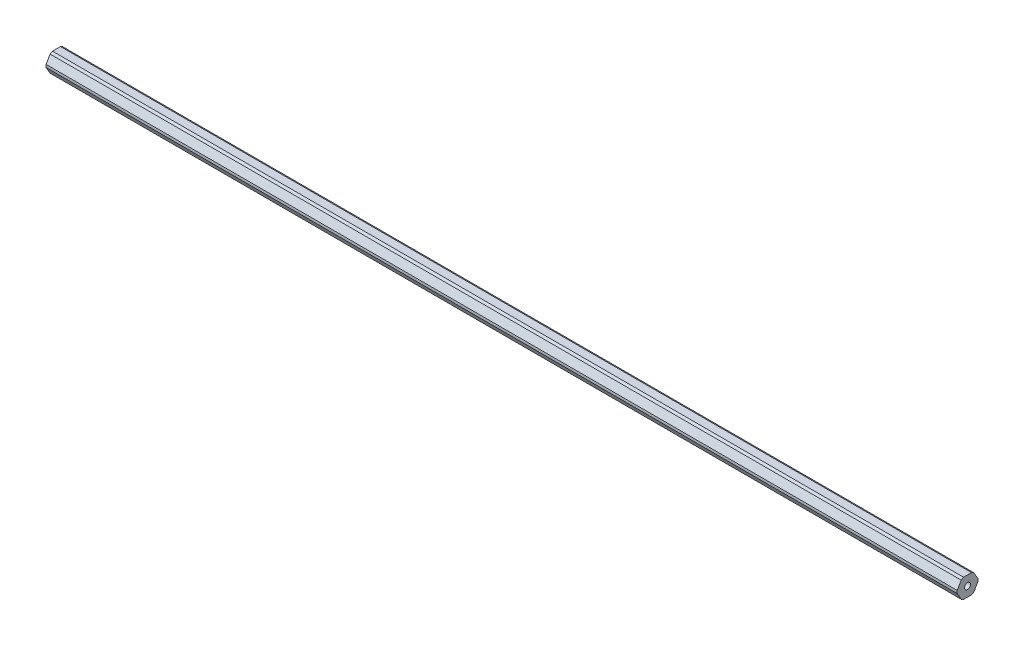
ISO-10303-21;
HEADER;
FILE_DESCRIPTION(('STEP AP214'),'2;1');
FILE_NAME('part.step','',(''),(''),'','','');
FILE_SCHEMA(('AUTOMOTIVE_DESIGN { 1 0 10303 214 1 1 1 1 }'));
ENDSEC;
DATA;
#1=APPLICATION_CONTEXT('core data for automotive mechanical design processes');
#2=APPLICATION_PROTOCOL_DEFINITION('international standard','automotive_design',2000,#1);
#3=PRODUCT_CONTEXT('',#1,'mechanical');
#4=PRODUCT('Part','Part','',(#3));
#5=PRODUCT_RELATED_PRODUCT_CATEGORY('part','',(#4));
#6=PRODUCT_DEFINITION_FORMATION('','',#4);
#7=PRODUCT_DEFINITION_CONTEXT('part definition',#1,'design');
#8=PRODUCT_DEFINITION('design','',#6,#7);
#9=PRODUCT_DEFINITION_SHAPE('','',#8);
#10=(LENGTH_UNIT() NAMED_UNIT(*) SI_UNIT(.MILLI.,.METRE.));
#11=(NAMED_UNIT(*) PLANE_ANGLE_UNIT() SI_UNIT($,.RADIAN.));
#12=(NAMED_UNIT(*) SI_UNIT($,.STERADIAN.) SOLID_ANGLE_UNIT());
#13=UNCERTAINTY_MEASURE_WITH_UNIT(LENGTH_MEASURE(1.E-05),#10,'distance_accuracy_value','');
#14=(GEOMETRIC_REPRESENTATION_CONTEXT(3) GLOBAL_UNCERTAINTY_ASSIGNED_CONTEXT((#13)) GLOBAL_UNIT_ASSIGNED_CONTEXT((#10,
#11,#12)) REPRESENTATION_CONTEXT('',''));
#15=CARTESIAN_POINT('',(0.,0.,0.));
#16=DIRECTION('',(0.,0.,1.));
#17=DIRECTION('',(1.,0.,0.));
#18=AXIS2_PLACEMENT_3D('',#15,#16,#17);
#19=CARTESIAN_POINT('',(293.6875,-47.9404901301149,172.641597773738));
#20=DIRECTION('',(0.,-0.5,0.866025403784439));
#21=DIRECTION('',(0.,-0.866025403784439,-0.5));
#22=AXIS2_PLACEMENT_3D('',#19,#20,#21);
#23=PLANE('',#22);
#24=DIRECTION('',(-1.,0.,0.));
#25=VECTOR('',#24,1.);
#26=CARTESIAN_POINT('',(293.6875,-50.221308772571,171.324766516543));
#27=LINE('',#26,#25);
#28=CARTESIAN_POINT('',(293.6875,-50.221308772571,171.324766516543));
#29=VERTEX_POINT('',#28);
#30=CARTESIAN_POINT('',(-306.3875,-50.2213087725709,171.324766516543));
#31=VERTEX_POINT('',#30);
#32=EDGE_CURVE('E183',#29,#31,#27,.T.);
#33=ORIENTED_EDGE('',*,*,#32,.T.);
#34=DIRECTION('',(0.,-0.866025403784438,-0.5));
#35=VECTOR('',#34,1.);
#36=CARTESIAN_POINT('',(-306.3875,-47.9404901301149,172.641597773738));
#37=LINE('',#36,#35);
#38=CARTESIAN_POINT('',(-306.3875,-45.6596714876589,173.958429030933));
#39=VERTEX_POINT('',#38);
#40=EDGE_CURVE('E143',#39,#31,#37,.T.);
#41=ORIENTED_EDGE('',*,*,#40,.F.);
#42=DIRECTION('',(-1.,0.,0.));
#43=VECTOR('',#42,1.);
#44=CARTESIAN_POINT('',(293.6875,-45.6596714876588,173.958429030933));
#45=LINE('',#44,#43);
#46=CARTESIAN_POINT('',(293.6875,-45.6596714876588,173.958429030933));
#47=VERTEX_POINT('',#46);
#48=EDGE_CURVE('E186',#39,#47,#45,.F.);
#49=ORIENTED_EDGE('',*,*,#48,.T.);
#50=DIRECTION('',(0.,0.866025403784439,0.5));
#51=VECTOR('',#50,1.);
#52=CARTESIAN_POINT('',(293.6875,-47.9404901301149,172.641597773738));
#53=LINE('',#52,#51);
#54=EDGE_CURVE('E194',#29,#47,#53,.T.);
#55=ORIENTED_EDGE('',*,*,#54,.F.);
#56=EDGE_LOOP('',(#33,#41,#49,#55));
#57=FACE_BOUND('',#56,.T.);
#58=ADVANCED_FACE('F17',(#57),#23,.F.);
#59=CARTESIAN_POINT('',(293.6875,-44.7652166473933,178.141332773738));
#60=DIRECTION('',(0.,-1.,0.));
#61=DIRECTION('',(0.,0.,-1.));
#62=AXIS2_PLACEMENT_3D('',#59,#60,#61);
#63=PLANE('',#62);
#64=DIRECTION('',(-1.,0.,0.));
#65=VECTOR('',#64,1.);
#66=CARTESIAN_POINT('',(293.6875,-44.7652166473933,175.507670259349));
#67=LINE('',#66,#65);
#68=CARTESIAN_POINT('',(293.6875,-44.7652166473933,175.507670259349));
#69=VERTEX_POINT('',#68);
#70=CARTESIAN_POINT('',(-306.3875,-44.7652166473933,175.507670259349));
#71=VERTEX_POINT('',#70);
#72=EDGE_CURVE('E118',#69,#71,#67,.T.);
#73=ORIENTED_EDGE('',*,*,#72,.T.);
#74=DIRECTION('',(0.,0.,-1.));
#75=VECTOR('',#74,1.);
#76=CARTESIAN_POINT('',(-306.3875,-44.7652166473933,178.141332773738));
#77=LINE('',#76,#75);
#78=CARTESIAN_POINT('',(-306.3875,-44.7652166473933,180.774995288128));
#79=VERTEX_POINT('',#78);
#80=EDGE_CURVE('E136',#79,#71,#77,.T.);
#81=ORIENTED_EDGE('',*,*,#80,.F.);
#82=DIRECTION('',(-1.,0.,0.));
#83=VECTOR('',#82,1.);
#84=CARTESIAN_POINT('',(293.6875,-44.7652166473933,180.774995288128));
#85=LINE('',#84,#83);
#86=CARTESIAN_POINT('',(293.6875,-44.7652166473933,180.774995288128));
#87=VERTEX_POINT('',#86);
#88=EDGE_CURVE('E179',#79,#87,#85,.F.);
#89=ORIENTED_EDGE('',*,*,#88,.T.);
#90=DIRECTION('',(0.,0.,1.));
#91=VECTOR('',#90,1.);
#92=CARTESIAN_POINT('',(293.6875,-44.7652166473933,178.141332773738));
#93=LINE('',#92,#91);
#94=EDGE_CURVE('E198',#69,#87,#93,.T.);
#95=ORIENTED_EDGE('',*,*,#94,.F.);
#96=EDGE_LOOP('',(#73,#81,#89,#95));
#97=FACE_BOUND('',#96,.T.);
#98=ADVANCED_FACE('F257',(#97),#63,.F.);
#99=CARTESIAN_POINT('',(293.6875,-47.9404901301149,183.641067773738));
#100=DIRECTION('',(0.,-0.5,-0.866025403784438));
#101=DIRECTION('',(0.,0.866025403784439,-0.5));
#102=AXIS2_PLACEMENT_3D('',#99,#100,#101);
#103=PLANE('',#102);
#104=DIRECTION('',(-1.,0.,0.));
#105=VECTOR('',#104,1.);
#106=CARTESIAN_POINT('',(293.6875,-45.6596714876588,182.324236516543));
#107=LINE('',#106,#105);
#108=CARTESIAN_POINT('',(293.6875,-45.6596714876588,182.324236516543));
#109=VERTEX_POINT('',#108);
#110=CARTESIAN_POINT('',(-306.3875,-45.6596714876588,182.324236516543));
#111=VERTEX_POINT('',#110);
#112=EDGE_CURVE('E119',#109,#111,#107,.T.);
#113=ORIENTED_EDGE('',*,*,#112,.T.);
#114=DIRECTION('',(0.,0.866025403784439,-0.5));
#115=VECTOR('',#114,1.);
#116=CARTESIAN_POINT('',(-306.3875,-47.9404901301149,183.641067773738));
#117=LINE('',#116,#115);
#118=CARTESIAN_POINT('',(-306.3875,-50.2213087725709,184.957899030933));
#119=VERTEX_POINT('',#118);
#120=EDGE_CURVE('E125',#119,#111,#117,.T.);
#121=ORIENTED_EDGE('',*,*,#120,.F.);
#122=DIRECTION('',(-1.,0.,0.));
#123=VECTOR('',#122,1.);
#124=CARTESIAN_POINT('',(293.6875,-50.221308772571,184.957899030933));
#125=LINE('',#124,#123);
#126=CARTESIAN_POINT('',(293.6875,-50.2213087725709,184.957899030933));
#127=VERTEX_POINT('',#126);
#128=EDGE_CURVE('E106',#119,#127,#125,.F.);
#129=ORIENTED_EDGE('',*,*,#128,.T.);
#130=DIRECTION('',(0.,-0.866025403784439,0.5));
#131=VECTOR('',#130,1.);
#132=CARTESIAN_POINT('',(293.6875,-47.9404901301149,183.641067773738));
#133=LINE('',#132,#131);
#134=EDGE_CURVE('E202',#109,#127,#133,.T.);
#135=ORIENTED_EDGE('',*,*,#134,.F.);
#136=EDGE_LOOP('',(#113,#121,#129,#135));
#137=FACE_BOUND('',#136,.T.);
#138=ADVANCED_FACE('F133',(#137),#103,.F.);
#139=CARTESIAN_POINT('',(293.6875,-54.2910370955581,183.641067773738));
#140=DIRECTION('',(0.,0.5,-0.866025403784438));
#141=DIRECTION('',(0.,0.866025403784439,0.5));
#142=AXIS2_PLACEMENT_3D('',#139,#140,#141);
#143=PLANE('',#142);
#144=DIRECTION('',(-1.,0.,0.));
#145=VECTOR('',#144,1.);
#146=CARTESIAN_POINT('',(293.6875,-52.0102184531021,184.957899030933));
#147=LINE('',#146,#145);
#148=CARTESIAN_POINT('',(293.6875,-52.0102184531021,184.957899030933));
#149=VERTEX_POINT('',#148);
#150=CARTESIAN_POINT('',(-306.3875,-52.0102184531021,184.957899030933));
#151=VERTEX_POINT('',#150);
#152=EDGE_CURVE('E169',#149,#151,#147,.T.);
#153=ORIENTED_EDGE('',*,*,#152,.T.);
#154=DIRECTION('',(0.,0.866025403784439,0.5));
#155=VECTOR('',#154,1.);
#156=CARTESIAN_POINT('',(-306.3875,-54.2910370955581,183.641067773738));
#157=LINE('',#156,#155);
#158=CARTESIAN_POINT('',(-306.3875,-56.5718557380142,182.324236516543));
#159=VERTEX_POINT('',#158);
#160=EDGE_CURVE('E128',#159,#151,#157,.T.);
#161=ORIENTED_EDGE('',*,*,#160,.F.);
#162=DIRECTION('',(-1.,0.,0.));
#163=VECTOR('',#162,1.);
#164=CARTESIAN_POINT('',(293.6875,-56.5718557380142,182.324236516543));
#165=LINE('',#164,#163);
#166=CARTESIAN_POINT('',(293.6875,-56.5718557380142,182.324236516543));
#167=VERTEX_POINT('',#166);
#168=EDGE_CURVE('E172',#159,#167,#165,.F.);
#169=ORIENTED_EDGE('',*,*,#168,.T.);
#170=DIRECTION('',(0.,-0.866025403784439,-0.5));
#171=VECTOR('',#170,1.);
#172=CARTESIAN_POINT('',(293.6875,-54.2910370955581,183.641067773738));
#173=LINE('',#172,#171);
#174=EDGE_CURVE('E205',#149,#167,#173,.T.);
#175=ORIENTED_EDGE('',*,*,#174,.F.);
#176=EDGE_LOOP('',(#153,#161,#169,#175));
#177=FACE_BOUND('',#176,.T.);
#178=ADVANCED_FACE('F277',(#177),#143,.F.);
#179=CARTESIAN_POINT('',(293.6875,-57.4663105782797,178.141332773738));
#180=DIRECTION('',(0.,1.,0.));
#181=DIRECTION('',(0.,0.,1.));
#182=AXIS2_PLACEMENT_3D('',#179,#180,#181);
#183=PLANE('',#182);
#184=DIRECTION('',(-1.,0.,0.));
#185=VECTOR('',#184,1.);
#186=CARTESIAN_POINT('',(293.6875,-57.4663105782797,180.774995288128));
#187=LINE('',#186,#185);
#188=CARTESIAN_POINT('',(293.6875,-57.4663105782797,180.774995288128));
#189=VERTEX_POINT('',#188);
#190=CARTESIAN_POINT('',(-306.3875,-57.4663105782797,180.774995288128));
#191=VERTEX_POINT('',#190);
#192=EDGE_CURVE('E162',#189,#191,#187,.T.);
#193=ORIENTED_EDGE('',*,*,#192,.T.);
#194=DIRECTION('',(0.,0.,1.));
#195=VECTOR('',#194,1.);
#196=CARTESIAN_POINT('',(-306.3875,-57.4663105782797,178.141332773738));
#197=LINE('',#196,#195);
#198=CARTESIAN_POINT('',(-306.3875,-57.4663105782797,175.507670259349));
#199=VERTEX_POINT('',#198);
#200=EDGE_CURVE('E146',#199,#191,#197,.T.);
#201=ORIENTED_EDGE('',*,*,#200,.F.);
#202=DIRECTION('',(-1.,0.,0.));
#203=VECTOR('',#202,1.);
#204=CARTESIAN_POINT('',(293.6875,-57.4663105782797,175.507670259349));
#205=LINE('',#204,#203);
#206=CARTESIAN_POINT('',(293.6875,-57.4663105782797,175.507670259349));
#207=VERTEX_POINT('',#206);
#208=EDGE_CURVE('E165',#199,#207,#205,.F.);
#209=ORIENTED_EDGE('',*,*,#208,.T.);
#210=DIRECTION('',(0.,0.,-1.));
#211=VECTOR('',#210,1.);
#212=CARTESIAN_POINT('',(293.6875,-57.4663105782797,178.141332773738));
#213=LINE('',#212,#211);
#214=EDGE_CURVE('E25',#189,#207,#213,.T.);
#215=ORIENTED_EDGE('',*,*,#214,.F.);
#216=EDGE_LOOP('',(#193,#201,#209,#215));
#217=FACE_BOUND('',#216,.T.);
#218=ADVANCED_FACE('F217',(#217),#183,.F.);
#219=CARTESIAN_POINT('',(293.6875,-54.2910370955581,172.641597773738));
#220=DIRECTION('',(0.,0.5,0.866025403784438));
#221=DIRECTION('',(0.,-0.866025403784438,0.5));
#222=AXIS2_PLACEMENT_3D('',#219,#220,#221);
#223=PLANE('',#222);
#224=DIRECTION('',(-1.,0.,0.));
#225=VECTOR('',#224,1.);
#226=CARTESIAN_POINT('',(293.6875,-56.5718557380141,173.958429030933));
#227=LINE('',#226,#225);
#228=CARTESIAN_POINT('',(293.6875,-56.5718557380141,173.958429030933));
#229=VERTEX_POINT('',#228);
#230=CARTESIAN_POINT('',(-306.3875,-56.5718557380142,173.958429030933));
#231=VERTEX_POINT('',#230);
#232=EDGE_CURVE('E40',#229,#231,#227,.T.);
#233=ORIENTED_EDGE('',*,*,#232,.T.);
#234=DIRECTION('',(0.,-0.866025403784439,0.5));
#235=VECTOR('',#234,1.);
#236=CARTESIAN_POINT('',(-306.3875,-54.2910370955581,172.641597773738));
#237=LINE('',#236,#235);
#238=CARTESIAN_POINT('',(-306.3875,-52.0102184531021,171.324766516543));
#239=VERTEX_POINT('',#238);
#240=EDGE_CURVE('E227',#239,#231,#237,.T.);
#241=ORIENTED_EDGE('',*,*,#240,.F.);
#242=DIRECTION('',(-1.,0.,0.));
#243=VECTOR('',#242,1.);
#244=CARTESIAN_POINT('',(293.6875,-52.0102184531021,171.324766516543));
#245=LINE('',#244,#243);
#246=CARTESIAN_POINT('',(293.6875,-52.0102184531021,171.324766516543));
#247=VERTEX_POINT('',#246);
#248=EDGE_CURVE('E159',#239,#247,#245,.F.);
#249=ORIENTED_EDGE('',*,*,#248,.T.);
#250=DIRECTION('',(0.,0.866025403784438,-0.5));
#251=VECTOR('',#250,1.);
#252=CARTESIAN_POINT('',(293.6875,-54.2910370955581,172.641597773738));
#253=LINE('',#252,#251);
#254=EDGE_CURVE('E11',#229,#247,#253,.T.);
#255=ORIENTED_EDGE('',*,*,#254,.F.);
#256=EDGE_LOOP('',(#233,#241,#249,#255));
#257=FACE_BOUND('',#256,.T.);
#258=ADVANCED_FACE('F267',(#257),#223,.F.);
#259=CARTESIAN_POINT('',(293.6875,-51.1157636128365,178.141332773738));
#260=DIRECTION('',(1.,0.,0.));
#261=DIRECTION('',(0.,0.,-1.));
#262=AXIS2_PLACEMENT_3D('',#259,#260,#261);
#263=PLANE('',#262);
#264=CARTESIAN_POINT('',(293.6875,-51.1157636128365,178.141332773738));
#265=DIRECTION('',(1.,0.,0.));
#266=DIRECTION('',(0.,0.,-1.));
#267=AXIS2_PLACEMENT_3D('',#264,#265,#266);
#268=CIRCLE('',#267,2.);
#269=CARTESIAN_POINT('',(293.6875,-51.1157636128365,176.141332773738));
#270=VERTEX_POINT('',#269);
#271=EDGE_CURVE('E190',#270,#270,#268,.T.);
#272=ORIENTED_EDGE('',*,*,#271,.F.);
#273=EDGE_LOOP('',(#272));
#274=FACE_BOUND('',#273,.T.);
#275=ORIENTED_EDGE('',*,*,#54,.T.);
#276=CARTESIAN_POINT('',(293.6875,-51.1157636128365,178.141332773738));
#277=DIRECTION('',(1.,0.,0.));
#278=DIRECTION('',(0.,0.,-1.));
#279=AXIS2_PLACEMENT_3D('',#276,#277,#278);
#280=CIRCLE('',#279,6.875);
#281=EDGE_CURVE('E156',#47,#69,#280,.T.);
#282=ORIENTED_EDGE('',*,*,#281,.T.);
#283=ORIENTED_EDGE('',*,*,#94,.T.);
#284=EDGE_CURVE('E244',#87,#109,#280,.T.);
#285=ORIENTED_EDGE('',*,*,#284,.T.);
#286=ORIENTED_EDGE('',*,*,#134,.T.);
#287=EDGE_CURVE('E112',#127,#149,#280,.T.);
#288=ORIENTED_EDGE('',*,*,#287,.T.);
#289=ORIENTED_EDGE('',*,*,#174,.T.);
#290=EDGE_CURVE('E215',#167,#189,#280,.T.);
#291=ORIENTED_EDGE('',*,*,#290,.T.);
#292=ORIENTED_EDGE('',*,*,#214,.T.);
#293=EDGE_CURVE('E155',#207,#229,#280,.T.);
#294=ORIENTED_EDGE('',*,*,#293,.T.);
#295=ORIENTED_EDGE('',*,*,#254,.T.);
#296=EDGE_CURVE('E32',#247,#29,#280,.T.);
#297=ORIENTED_EDGE('',*,*,#296,.T.);
#298=EDGE_LOOP('',(#275,#282,#283,#285,#286,#288,#289,#291,#292,#294,#295,#297));
#299=FACE_BOUND('',#298,.T.);
#300=ADVANCED_FACE('F213',(#274,#299),#263,.T.);
#301=CARTESIAN_POINT('',(293.6875,-51.1157636128365,178.141332773738));
#302=DIRECTION('',(-1.,0.,0.));
#303=DIRECTION('',(0.,0.,1.));
#304=AXIS2_PLACEMENT_3D('',#301,#302,#303);
#305=CYLINDRICAL_SURFACE('',#304,2.);
#306=ORIENTED_EDGE('',*,*,#271,.T.);
#307=EDGE_LOOP('',(#306));
#308=FACE_BOUND('',#307,.T.);
#309=CARTESIAN_POINT('',(-306.3875,-51.1157636128365,178.141332773738));
#310=DIRECTION('',(-1.,0.,0.));
#311=DIRECTION('',(0.,0.,1.));
#312=AXIS2_PLACEMENT_3D('',#309,#310,#311);
#313=CIRCLE('',#312,2.);
#314=CARTESIAN_POINT('',(-306.3875,-51.1157636128365,180.141332773738));
#315=VERTEX_POINT('',#314);
#316=EDGE_CURVE('E234',#315,#315,#313,.T.);
#317=ORIENTED_EDGE('',*,*,#316,.T.);
#318=EDGE_LOOP('',(#317));
#319=FACE_BOUND('',#318,.T.);
#320=ADVANCED_FACE('F274',(#308,#319),#305,.F.);
#321=CARTESIAN_POINT('',(293.6875,-51.1157636128365,178.141332773738));
#322=DIRECTION('',(-1.,0.,0.));
#323=DIRECTION('',(0.,0.,1.));
#324=AXIS2_PLACEMENT_3D('',#321,#322,#323);
#325=CYLINDRICAL_SURFACE('',#324,6.875);
#326=ORIENTED_EDGE('',*,*,#208,.F.);
#327=CARTESIAN_POINT('',(-306.3875,-51.1157636128365,178.141332773738));
#328=DIRECTION('',(-1.,0.,0.));
#329=DIRECTION('',(0.,0.,1.));
#330=AXIS2_PLACEMENT_3D('',#327,#328,#329);
#331=CIRCLE('',#330,6.875);
#332=EDGE_CURVE('E223',#231,#199,#331,.T.);
#333=ORIENTED_EDGE('',*,*,#332,.F.);
#334=ORIENTED_EDGE('',*,*,#232,.F.);
#335=ORIENTED_EDGE('',*,*,#293,.F.);
#336=EDGE_LOOP('',(#326,#333,#334,#335));
#337=FACE_BOUND('',#336,.T.);
#338=ADVANCED_FACE('F222',(#337),#325,.T.);
#339=ORIENTED_EDGE('',*,*,#296,.F.);
#340=ORIENTED_EDGE('',*,*,#248,.F.);
#341=EDGE_CURVE('E229',#31,#239,#331,.T.);
#342=ORIENTED_EDGE('',*,*,#341,.F.);
#343=ORIENTED_EDGE('',*,*,#32,.F.);
#344=EDGE_LOOP('',(#339,#340,#342,#343));
#345=FACE_BOUND('',#344,.T.);
#346=ADVANCED_FACE('F265',(#345),#325,.T.);
#347=ORIENTED_EDGE('',*,*,#168,.F.);
#348=EDGE_CURVE('E130',#191,#159,#331,.T.);
#349=ORIENTED_EDGE('',*,*,#348,.F.);
#350=ORIENTED_EDGE('',*,*,#192,.F.);
#351=ORIENTED_EDGE('',*,*,#290,.F.);
#352=EDGE_LOOP('',(#347,#349,#350,#351));
#353=FACE_BOUND('',#352,.T.);
#354=ADVANCED_FACE('F290',(#353),#325,.T.);
#355=ORIENTED_EDGE('',*,*,#128,.F.);
#356=EDGE_CURVE('E109',#151,#119,#331,.T.);
#357=ORIENTED_EDGE('',*,*,#356,.F.);
#358=ORIENTED_EDGE('',*,*,#152,.F.);
#359=ORIENTED_EDGE('',*,*,#287,.F.);
#360=EDGE_LOOP('',(#355,#357,#358,#359));
#361=FACE_BOUND('',#360,.T.);
#362=ADVANCED_FACE('F108',(#361),#325,.T.);
#363=ORIENTED_EDGE('',*,*,#88,.F.);
#364=EDGE_CURVE('E132',#111,#79,#331,.T.);
#365=ORIENTED_EDGE('',*,*,#364,.F.);
#366=ORIENTED_EDGE('',*,*,#112,.F.);
#367=ORIENTED_EDGE('',*,*,#284,.F.);
#368=EDGE_LOOP('',(#363,#365,#366,#367));
#369=FACE_BOUND('',#368,.T.);
#370=ADVANCED_FACE('F296',(#369),#325,.T.);
#371=ORIENTED_EDGE('',*,*,#48,.F.);
#372=EDGE_CURVE('E231',#71,#39,#331,.T.);
#373=ORIENTED_EDGE('',*,*,#372,.F.);
#374=ORIENTED_EDGE('',*,*,#72,.F.);
#375=ORIENTED_EDGE('',*,*,#281,.F.);
#376=EDGE_LOOP('',(#371,#373,#374,#375));
#377=FACE_BOUND('',#376,.T.);
#378=ADVANCED_FACE('F260',(#377),#325,.T.);
#379=CARTESIAN_POINT('',(-306.3875,-51.1157636128365,178.141332773738));
#380=DIRECTION('',(-1.,0.,0.));
#381=DIRECTION('',(0.,0.,-1.));
#382=AXIS2_PLACEMENT_3D('',#379,#380,#381);
#383=PLANE('',#382);
#384=ORIENTED_EDGE('',*,*,#316,.F.);
#385=EDGE_LOOP('',(#384));
#386=FACE_BOUND('',#385,.T.);
#387=ORIENTED_EDGE('',*,*,#120,.T.);
#388=ORIENTED_EDGE('',*,*,#364,.T.);
#389=ORIENTED_EDGE('',*,*,#80,.T.);
#390=ORIENTED_EDGE('',*,*,#372,.T.);
#391=ORIENTED_EDGE('',*,*,#40,.T.);
#392=ORIENTED_EDGE('',*,*,#341,.T.);
#393=ORIENTED_EDGE('',*,*,#240,.T.);
#394=ORIENTED_EDGE('',*,*,#332,.T.);
#395=ORIENTED_EDGE('',*,*,#200,.T.);
#396=ORIENTED_EDGE('',*,*,#348,.T.);
#397=ORIENTED_EDGE('',*,*,#160,.T.);
#398=ORIENTED_EDGE('',*,*,#356,.T.);
#399=EDGE_LOOP('',(#387,#388,#389,#390,#391,#392,#393,#394,#395,#396,#397,#398));
#400=FACE_BOUND('',#399,.T.);
#401=ADVANCED_FACE('F123',(#386,#400),#383,.T.);
#402=CLOSED_SHELL('',(#58,#98,#138,#178,#218,#258,#300,#320,#338,#346,#354,#362,#370,#378,#401));
#403=MANIFOLD_SOLID_BREP('B1',#402);
#404=ADVANCED_BREP_SHAPE_REPRESENTATION('',(#18,#403),#14);
#405=SHAPE_DEFINITION_REPRESENTATION(#9,#404);
ENDSEC;
END-ISO-10303-21;
